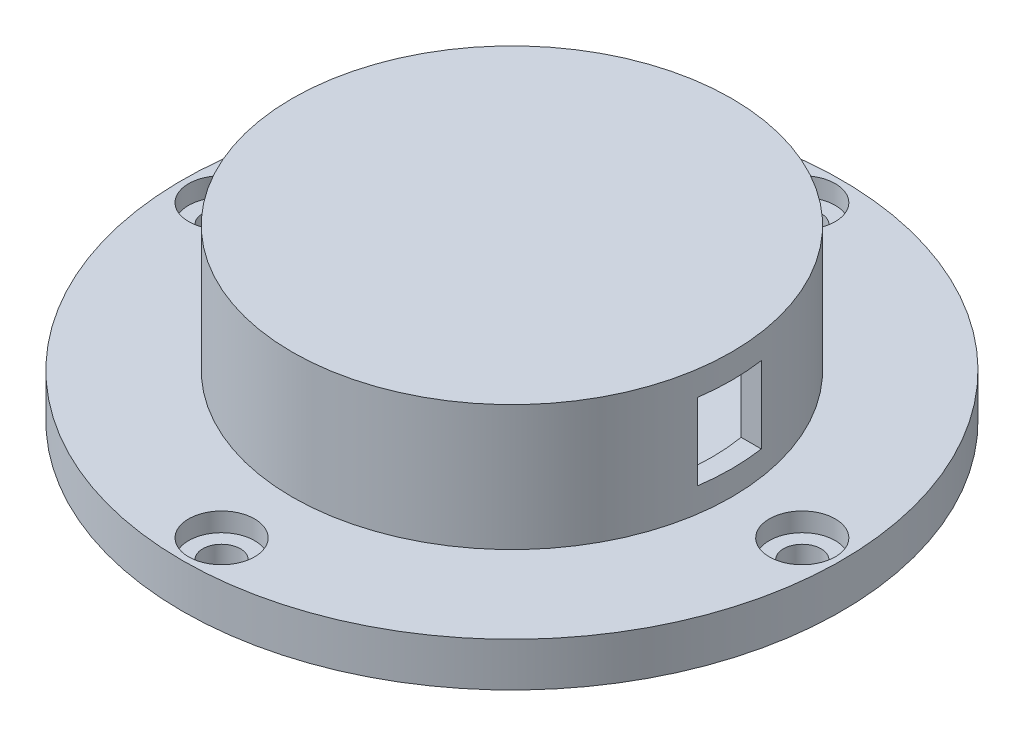
ISO-10303-21;
HEADER;
FILE_DESCRIPTION(('STEP AP214'),'2;1');
FILE_NAME('part.step','',(''),(''),'','','');
FILE_SCHEMA(('AUTOMOTIVE_DESIGN { 1 0 10303 214 1 1 1 1 }'));
ENDSEC;
DATA;
#1=APPLICATION_CONTEXT('core data for automotive mechanical design processes');
#2=APPLICATION_PROTOCOL_DEFINITION('international standard','automotive_design',2000,#1);
#3=PRODUCT_CONTEXT('',#1,'mechanical');
#4=PRODUCT('Part','Part','',(#3));
#5=PRODUCT_RELATED_PRODUCT_CATEGORY('part','',(#4));
#6=PRODUCT_DEFINITION_FORMATION('','',#4);
#7=PRODUCT_DEFINITION_CONTEXT('part definition',#1,'design');
#8=PRODUCT_DEFINITION('design','',#6,#7);
#9=PRODUCT_DEFINITION_SHAPE('','',#8);
#10=(LENGTH_UNIT() NAMED_UNIT(*) SI_UNIT(.MILLI.,.METRE.));
#11=(NAMED_UNIT(*) PLANE_ANGLE_UNIT() SI_UNIT($,.RADIAN.));
#12=(NAMED_UNIT(*) SI_UNIT($,.STERADIAN.) SOLID_ANGLE_UNIT());
#13=UNCERTAINTY_MEASURE_WITH_UNIT(LENGTH_MEASURE(1.E-05),#10,'distance_accuracy_value','');
#14=(GEOMETRIC_REPRESENTATION_CONTEXT(3) GLOBAL_UNCERTAINTY_ASSIGNED_CONTEXT((#13)) GLOBAL_UNIT_ASSIGNED_CONTEXT((#10,
#11,#12)) REPRESENTATION_CONTEXT('',''));
#15=CARTESIAN_POINT('',(0.,0.,0.));
#16=DIRECTION('',(0.,0.,1.));
#17=DIRECTION('',(1.,0.,0.));
#18=AXIS2_PLACEMENT_3D('',#15,#16,#17);
#19=CARTESIAN_POINT('',(0.,27.,0.));
#20=DIRECTION('',(0.,-1.,0.));
#21=DIRECTION('',(0.,0.,-1.));
#22=AXIS2_PLACEMENT_3D('',#19,#20,#21);
#23=CYLINDRICAL_SURFACE('',#22,31.83);
#24=DIRECTION('',(0.,-1.,0.));
#25=VECTOR('',#24,1.);
#26=CARTESIAN_POINT('',(-31.4187666848971,27.,5.1));
#27=LINE('',#26,#25);
#28=CARTESIAN_POINT('',(-31.4187666848971,23.1,5.1));
#29=VERTEX_POINT('',#28);
#30=CARTESIAN_POINT('',(-31.4187666848971,10.9,5.1));
#31=VERTEX_POINT('',#30);
#32=EDGE_CURVE('E239',#29,#31,#27,.T.);
#33=ORIENTED_EDGE('',*,*,#32,.F.);
#34=CARTESIAN_POINT('',(0.,23.1,0.));
#35=DIRECTION('',(0.,-1.,0.));
#36=DIRECTION('',(0.,0.,-1.));
#37=AXIS2_PLACEMENT_3D('',#34,#35,#36);
#38=CIRCLE('',#37,31.83);
#39=CARTESIAN_POINT('',(-31.4187666848971,23.1,-5.1));
#40=VERTEX_POINT('',#39);
#41=EDGE_CURVE('E11',#29,#40,#38,.T.);
#42=ORIENTED_EDGE('',*,*,#41,.T.);
#43=DIRECTION('',(0.,-1.,0.));
#44=VECTOR('',#43,1.);
#45=CARTESIAN_POINT('',(-31.4187666848971,27.,-5.1));
#46=LINE('',#45,#44);
#47=CARTESIAN_POINT('',(-31.4187666848971,10.9,-5.1));
#48=VERTEX_POINT('',#47);
#49=EDGE_CURVE('E47',#40,#48,#46,.T.);
#50=ORIENTED_EDGE('',*,*,#49,.T.);
#51=CARTESIAN_POINT('',(0.,10.9,0.));
#52=DIRECTION('',(0.,-1.,0.));
#53=DIRECTION('',(0.,0.,-1.));
#54=AXIS2_PLACEMENT_3D('',#51,#52,#53);
#55=CIRCLE('',#54,31.83);
#56=EDGE_CURVE('E234',#31,#48,#55,.T.);
#57=ORIENTED_EDGE('',*,*,#56,.F.);
#58=EDGE_LOOP('',(#33,#42,#50,#57));
#59=FACE_BOUND('',#58,.T.);
#60=DIRECTION('',(0.,-1.,0.));
#61=VECTOR('',#60,1.);
#62=CARTESIAN_POINT('',(31.4187666848971,27.,-5.1));
#63=LINE('',#62,#61);
#64=CARTESIAN_POINT('',(31.4187666848971,10.9,-5.1));
#65=VERTEX_POINT('',#64);
#66=CARTESIAN_POINT('',(31.4187666848971,23.1,-5.1));
#67=VERTEX_POINT('',#66);
#68=EDGE_CURVE('E233',#65,#67,#63,.F.);
#69=ORIENTED_EDGE('',*,*,#68,.T.);
#70=CARTESIAN_POINT('',(31.4187666848971,23.1,5.1));
#71=VERTEX_POINT('',#70);
#72=EDGE_CURVE('E54',#67,#71,#38,.T.);
#73=ORIENTED_EDGE('',*,*,#72,.T.);
#74=DIRECTION('',(0.,-1.,0.));
#75=VECTOR('',#74,1.);
#76=CARTESIAN_POINT('',(31.4187666848971,27.,5.1));
#77=LINE('',#76,#75);
#78=CARTESIAN_POINT('',(31.4187666848971,10.9,5.1));
#79=VERTEX_POINT('',#78);
#80=EDGE_CURVE('E196',#79,#71,#77,.F.);
#81=ORIENTED_EDGE('',*,*,#80,.F.);
#82=EDGE_CURVE('E229',#65,#79,#55,.T.);
#83=ORIENTED_EDGE('',*,*,#82,.F.);
#84=EDGE_LOOP('',(#69,#73,#81,#83));
#85=FACE_BOUND('',#84,.T.);
#86=CARTESIAN_POINT('',(0.,7.,0.));
#87=DIRECTION('',(0.,1.,0.));
#88=DIRECTION('',(0.,0.,1.));
#89=AXIS2_PLACEMENT_3D('',#86,#87,#88);
#90=CIRCLE('',#89,31.83);
#91=CARTESIAN_POINT('',(0.,7.,31.83));
#92=VERTEX_POINT('',#91);
#93=EDGE_CURVE('E189',#92,#92,#90,.F.);
#94=ORIENTED_EDGE('',*,*,#93,.T.);
#95=EDGE_LOOP('',(#94));
#96=FACE_BOUND('',#95,.T.);
#97=CARTESIAN_POINT('',(0.,24.,0.));
#98=DIRECTION('',(0.,1.,0.));
#99=DIRECTION('',(0.,0.,1.));
#100=AXIS2_PLACEMENT_3D('',#97,#98,#99);
#101=CIRCLE('',#100,31.83);
#102=CARTESIAN_POINT('',(0.,24.,31.83));
#103=VERTEX_POINT('',#102);
#104=EDGE_CURVE('E290',#103,#103,#101,.T.);
#105=ORIENTED_EDGE('',*,*,#104,.T.);
#106=EDGE_LOOP('',(#105));
#107=FACE_BOUND('',#106,.T.);
#108=ADVANCED_FACE('F43',(#59,#85,#96,#107),#23,.F.);
#109=CARTESIAN_POINT('',(0.,27.,0.));
#110=DIRECTION('',(0.,-1.,0.));
#111=DIRECTION('',(0.,0.,-1.));
#112=AXIS2_PLACEMENT_3D('',#109,#110,#111);
#113=CYLINDRICAL_SURFACE('',#112,35.);
#114=CARTESIAN_POINT('',(0.,23.1,0.));
#115=DIRECTION('',(0.,-1.,0.));
#116=DIRECTION('',(0.,0.,-1.));
#117=AXIS2_PLACEMENT_3D('',#114,#115,#116);
#118=CIRCLE('',#117,35.);
#119=CARTESIAN_POINT('',(34.6264349883149,23.1,-5.1));
#120=VERTEX_POINT('',#119);
#121=CARTESIAN_POINT('',(34.6264349883149,23.1,5.1));
#122=VERTEX_POINT('',#121);
#123=EDGE_CURVE('E134',#120,#122,#118,.T.);
#124=ORIENTED_EDGE('',*,*,#123,.F.);
#125=DIRECTION('',(0.,-1.,0.));
#126=VECTOR('',#125,1.);
#127=CARTESIAN_POINT('',(34.6264349883149,27.,-5.1));
#128=LINE('',#127,#126);
#129=CARTESIAN_POINT('',(34.6264349883149,10.9,-5.1));
#130=VERTEX_POINT('',#129);
#131=EDGE_CURVE('E139',#130,#120,#128,.F.);
#132=ORIENTED_EDGE('',*,*,#131,.F.);
#133=CARTESIAN_POINT('',(0.,10.9,0.));
#134=DIRECTION('',(0.,-1.,0.));
#135=DIRECTION('',(0.,0.,-1.));
#136=AXIS2_PLACEMENT_3D('',#133,#134,#135);
#137=CIRCLE('',#136,35.);
#138=CARTESIAN_POINT('',(34.6264349883149,10.9,5.1));
#139=VERTEX_POINT('',#138);
#140=EDGE_CURVE('E267',#130,#139,#137,.T.);
#141=ORIENTED_EDGE('',*,*,#140,.T.);
#142=DIRECTION('',(0.,-1.,0.));
#143=VECTOR('',#142,1.);
#144=CARTESIAN_POINT('',(34.6264349883149,27.,5.1));
#145=LINE('',#144,#143);
#146=EDGE_CURVE('E119',#139,#122,#145,.F.);
#147=ORIENTED_EDGE('',*,*,#146,.T.);
#148=EDGE_LOOP('',(#124,#132,#141,#147));
#149=FACE_BOUND('',#148,.T.);
#150=CARTESIAN_POINT('',(0.,27.,0.));
#151=DIRECTION('',(0.,1.,0.));
#152=DIRECTION('',(0.,0.,1.));
#153=AXIS2_PLACEMENT_3D('',#150,#151,#152);
#154=CIRCLE('',#153,35.);
#155=CARTESIAN_POINT('',(0.,27.,35.));
#156=VERTEX_POINT('',#155);
#157=EDGE_CURVE('E175',#156,#156,#154,.T.);
#158=ORIENTED_EDGE('',*,*,#157,.F.);
#159=EDGE_LOOP('',(#158));
#160=FACE_BOUND('',#159,.T.);
#161=CARTESIAN_POINT('',(0.,7.,0.));
#162=DIRECTION('',(0.,1.,0.));
#163=DIRECTION('',(0.,0.,1.));
#164=AXIS2_PLACEMENT_3D('',#161,#162,#163);
#165=CIRCLE('',#164,35.);
#166=CARTESIAN_POINT('',(0.,7.,35.));
#167=VERTEX_POINT('',#166);
#168=EDGE_CURVE('E180',#167,#167,#165,.T.);
#169=ORIENTED_EDGE('',*,*,#168,.T.);
#170=EDGE_LOOP('',(#169));
#171=FACE_BOUND('',#170,.T.);
#172=CARTESIAN_POINT('',(-34.6264349883149,23.1,5.1));
#173=VERTEX_POINT('',#172);
#174=CARTESIAN_POINT('',(-34.6264349883149,23.1,-5.1));
#175=VERTEX_POINT('',#174);
#176=EDGE_CURVE('E124',#173,#175,#118,.T.);
#177=ORIENTED_EDGE('',*,*,#176,.F.);
#178=DIRECTION('',(0.,-1.,0.));
#179=VECTOR('',#178,1.);
#180=CARTESIAN_POINT('',(-34.6264349883149,27.,5.1));
#181=LINE('',#180,#179);
#182=CARTESIAN_POINT('',(-34.6264349883149,10.9,5.1));
#183=VERTEX_POINT('',#182);
#184=EDGE_CURVE('E109',#173,#183,#181,.T.);
#185=ORIENTED_EDGE('',*,*,#184,.T.);
#186=CARTESIAN_POINT('',(-34.6264349883149,10.9,-5.1));
#187=VERTEX_POINT('',#186);
#188=EDGE_CURVE('E118',#183,#187,#137,.T.);
#189=ORIENTED_EDGE('',*,*,#188,.T.);
#190=DIRECTION('',(0.,-1.,0.));
#191=VECTOR('',#190,1.);
#192=CARTESIAN_POINT('',(-34.6264349883149,27.,-5.1));
#193=LINE('',#192,#191);
#194=EDGE_CURVE('E132',#175,#187,#193,.T.);
#195=ORIENTED_EDGE('',*,*,#194,.F.);
#196=EDGE_LOOP('',(#177,#185,#189,#195));
#197=FACE_BOUND('',#196,.T.);
#198=ADVANCED_FACE('F131',(#149,#160,#171,#197),#113,.T.);
#199=CARTESIAN_POINT('',(46.2500000000013,-13.,-1.3060080739871E-12));
#200=DIRECTION('',(0.,1.,0.));
#201=DIRECTION('',(0.,0.,1.));
#202=AXIS2_PLACEMENT_3D('',#199,#200,#201);
#203=CYLINDRICAL_SURFACE('',#202,3.00000000000103);
#204=CARTESIAN_POINT('',(46.2500000000013,0.,-1.3060080739871E-12));
#205=DIRECTION('',(0.,1.,0.));
#206=DIRECTION('',(0.,0.,1.));
#207=AXIS2_PLACEMENT_3D('',#204,#205,#206);
#208=CIRCLE('',#207,3.00000000000103);
#209=CARTESIAN_POINT('',(46.2500000000013,0.,2.99999999999972));
#210=VERTEX_POINT('',#209);
#211=EDGE_CURVE('E197',#210,#210,#208,.T.);
#212=ORIENTED_EDGE('',*,*,#211,.F.);
#213=EDGE_LOOP('',(#212));
#214=FACE_BOUND('',#213,.T.);
#215=CARTESIAN_POINT('',(46.2500000000013,4.,-1.3060080739871E-12));
#216=DIRECTION('',(0.,1.,0.));
#217=DIRECTION('',(0.,0.,1.));
#218=AXIS2_PLACEMENT_3D('',#215,#216,#217);
#219=CIRCLE('',#218,3.00000000000103);
#220=CARTESIAN_POINT('',(46.2500000000013,4.,2.99999999999972));
#221=VERTEX_POINT('',#220);
#222=EDGE_CURVE('E202',#221,#221,#219,.F.);
#223=ORIENTED_EDGE('',*,*,#222,.F.);
#224=EDGE_LOOP('',(#223));
#225=FACE_BOUND('',#224,.T.);
#226=ADVANCED_FACE('F312',(#214,#225),#203,.F.);
#227=CARTESIAN_POINT('',(2.61278155222367E-12,-13.,46.25));
#228=DIRECTION('',(0.,1.,0.));
#229=DIRECTION('',(0.,0.,1.));
#230=AXIS2_PLACEMENT_3D('',#227,#228,#229);
#231=CYLINDRICAL_SURFACE('',#230,3.00000000000281);
#232=CARTESIAN_POINT('',(2.61278155222367E-12,0.,46.25));
#233=DIRECTION('',(0.,1.,0.));
#234=DIRECTION('',(0.,0.,1.));
#235=AXIS2_PLACEMENT_3D('',#232,#233,#234);
#236=CIRCLE('',#235,3.00000000000281);
#237=CARTESIAN_POINT('',(2.61278155222367E-12,0.,49.2500000000028));
#238=VERTEX_POINT('',#237);
#239=EDGE_CURVE('E201',#238,#238,#236,.T.);
#240=ORIENTED_EDGE('',*,*,#239,.F.);
#241=EDGE_LOOP('',(#240));
#242=FACE_BOUND('',#241,.T.);
#243=CARTESIAN_POINT('',(2.61278155222367E-12,4.,46.25));
#244=DIRECTION('',(0.,1.,0.));
#245=DIRECTION('',(0.,0.,1.));
#246=AXIS2_PLACEMENT_3D('',#243,#244,#245);
#247=CIRCLE('',#246,3.00000000000281);
#248=CARTESIAN_POINT('',(2.61278155222367E-12,4.,49.2500000000028));
#249=VERTEX_POINT('',#248);
#250=EDGE_CURVE('E220',#249,#249,#247,.F.);
#251=ORIENTED_EDGE('',*,*,#250,.F.);
#252=EDGE_LOOP('',(#251));
#253=FACE_BOUND('',#252,.T.);
#254=ADVANCED_FACE('F355',(#242,#253),#231,.F.);
#255=CARTESIAN_POINT('',(-46.2499999999987,-13.,1.31167206543316E-12));
#256=DIRECTION('',(0.,1.,0.));
#257=DIRECTION('',(0.,0.,1.));
#258=AXIS2_PLACEMENT_3D('',#255,#256,#257);
#259=CYLINDRICAL_SURFACE('',#258,3.0000000000021);
#260=CARTESIAN_POINT('',(-46.2499999999987,0.,1.31167206543316E-12));
#261=DIRECTION('',(0.,1.,0.));
#262=DIRECTION('',(0.,0.,1.));
#263=AXIS2_PLACEMENT_3D('',#260,#261,#262);
#264=CIRCLE('',#263,3.0000000000021);
#265=CARTESIAN_POINT('',(-46.2499999999987,0.,3.00000000000341));
#266=VERTEX_POINT('',#265);
#267=EDGE_CURVE('E206',#266,#266,#264,.T.);
#268=ORIENTED_EDGE('',*,*,#267,.F.);
#269=EDGE_LOOP('',(#268));
#270=FACE_BOUND('',#269,.T.);
#271=CARTESIAN_POINT('',(-46.2499999999987,4.,1.31167206543316E-12));
#272=DIRECTION('',(0.,1.,0.));
#273=DIRECTION('',(0.,0.,1.));
#274=AXIS2_PLACEMENT_3D('',#271,#272,#273);
#275=CIRCLE('',#274,3.0000000000021);
#276=CARTESIAN_POINT('',(-46.2499999999987,4.,3.00000000000341));
#277=VERTEX_POINT('',#276);
#278=EDGE_CURVE('E216',#277,#277,#275,.F.);
#279=ORIENTED_EDGE('',*,*,#278,.F.);
#280=EDGE_LOOP('',(#279));
#281=FACE_BOUND('',#280,.T.);
#282=ADVANCED_FACE('F347',(#270,#281),#259,.F.);
#283=CARTESIAN_POINT('',(0.,-13.,-46.25));
#284=DIRECTION('',(0.,1.,0.));
#285=DIRECTION('',(0.,0.,1.));
#286=AXIS2_PLACEMENT_3D('',#283,#284,#285);
#287=CYLINDRICAL_SURFACE('',#286,3.);
#288=CARTESIAN_POINT('',(0.,0.,-46.25));
#289=DIRECTION('',(0.,1.,0.));
#290=DIRECTION('',(0.,0.,1.));
#291=AXIS2_PLACEMENT_3D('',#288,#289,#290);
#292=CIRCLE('',#291,3.);
#293=CARTESIAN_POINT('',(0.,0.,-43.25));
#294=VERTEX_POINT('',#293);
#295=EDGE_CURVE('E184',#294,#294,#292,.T.);
#296=ORIENTED_EDGE('',*,*,#295,.F.);
#297=EDGE_LOOP('',(#296));
#298=FACE_BOUND('',#297,.T.);
#299=CARTESIAN_POINT('',(0.,4.,-46.25));
#300=DIRECTION('',(0.,1.,0.));
#301=DIRECTION('',(0.,0.,1.));
#302=AXIS2_PLACEMENT_3D('',#299,#300,#301);
#303=CIRCLE('',#302,3.);
#304=CARTESIAN_POINT('',(0.,4.,-43.25));
#305=VERTEX_POINT('',#304);
#306=EDGE_CURVE('E147',#305,#305,#303,.F.);
#307=ORIENTED_EDGE('',*,*,#306,.F.);
#308=EDGE_LOOP('',(#307));
#309=FACE_BOUND('',#308,.T.);
#310=ADVANCED_FACE('F342',(#298,#309),#287,.F.);
#311=CARTESIAN_POINT('',(0.,7.,0.));
#312=DIRECTION('',(0.,-1.,0.));
#313=DIRECTION('',(0.,0.,-1.));
#314=AXIS2_PLACEMENT_3D('',#311,#312,#313);
#315=CYLINDRICAL_SURFACE('',#314,52.5);
#316=CARTESIAN_POINT('',(0.,7.,0.));
#317=DIRECTION('',(0.,1.,0.));
#318=DIRECTION('',(0.,0.,1.));
#319=AXIS2_PLACEMENT_3D('',#316,#317,#318);
#320=CIRCLE('',#319,52.5);
#321=CARTESIAN_POINT('',(0.,7.,52.5));
#322=VERTEX_POINT('',#321);
#323=EDGE_CURVE('E185',#322,#322,#320,.T.);
#324=ORIENTED_EDGE('',*,*,#323,.F.);
#325=EDGE_LOOP('',(#324));
#326=FACE_BOUND('',#325,.T.);
#327=CARTESIAN_POINT('',(0.,0.,0.));
#328=DIRECTION('',(0.,1.,0.));
#329=DIRECTION('',(0.,0.,1.));
#330=AXIS2_PLACEMENT_3D('',#327,#328,#329);
#331=CIRCLE('',#330,52.5);
#332=CARTESIAN_POINT('',(0.,0.,52.5));
#333=VERTEX_POINT('',#332);
#334=EDGE_CURVE('E179',#333,#333,#331,.T.);
#335=ORIENTED_EDGE('',*,*,#334,.T.);
#336=EDGE_LOOP('',(#335));
#337=FACE_BOUND('',#336,.T.);
#338=ADVANCED_FACE('F45',(#326,#337),#315,.T.);
#339=CARTESIAN_POINT('',(0.,7.,0.));
#340=DIRECTION('',(0.,1.,0.));
#341=DIRECTION('',(0.,0.,1.));
#342=AXIS2_PLACEMENT_3D('',#339,#340,#341);
#343=PLANE('',#342);
#344=CARTESIAN_POINT('',(0.,7.,-46.25));
#345=DIRECTION('',(0.,1.,0.));
#346=DIRECTION('',(0.,0.,1.));
#347=AXIS2_PLACEMENT_3D('',#344,#345,#346);
#348=CIRCLE('',#347,5.25);
#349=CARTESIAN_POINT('',(0.,7.,-41.));
#350=VERTEX_POINT('',#349);
#351=EDGE_CURVE('E148',#350,#350,#348,.T.);
#352=ORIENTED_EDGE('',*,*,#351,.F.);
#353=EDGE_LOOP('',(#352));
#354=FACE_BOUND('',#353,.T.);
#355=CARTESIAN_POINT('',(46.2500000000013,7.,-1.3060080739871E-12));
#356=DIRECTION('',(0.,1.,0.));
#357=DIRECTION('',(0.,0.,1.));
#358=AXIS2_PLACEMENT_3D('',#355,#356,#357);
#359=CIRCLE('',#358,5.25000000000102);
#360=CARTESIAN_POINT('',(46.2500000000013,7.,5.24999999999972));
#361=VERTEX_POINT('',#360);
#362=EDGE_CURVE('E156',#361,#361,#359,.T.);
#363=ORIENTED_EDGE('',*,*,#362,.F.);
#364=EDGE_LOOP('',(#363));
#365=FACE_BOUND('',#364,.T.);
#366=CARTESIAN_POINT('',(2.61278155222367E-12,7.,46.25));
#367=DIRECTION('',(0.,1.,0.));
#368=DIRECTION('',(0.,0.,1.));
#369=AXIS2_PLACEMENT_3D('',#366,#367,#368);
#370=CIRCLE('',#369,5.25000000000281);
#371=CARTESIAN_POINT('',(2.61278155222367E-12,7.,51.5000000000028));
#372=VERTEX_POINT('',#371);
#373=EDGE_CURVE('E164',#372,#372,#370,.T.);
#374=ORIENTED_EDGE('',*,*,#373,.F.);
#375=EDGE_LOOP('',(#374));
#376=FACE_BOUND('',#375,.T.);
#377=CARTESIAN_POINT('',(-46.2499999999987,7.,1.31167206543316E-12));
#378=DIRECTION('',(0.,1.,0.));
#379=DIRECTION('',(0.,0.,1.));
#380=AXIS2_PLACEMENT_3D('',#377,#378,#379);
#381=CIRCLE('',#380,5.2500000000021);
#382=CARTESIAN_POINT('',(-46.2499999999987,7.,5.25000000000341));
#383=VERTEX_POINT('',#382);
#384=EDGE_CURVE('E138',#383,#383,#381,.T.);
#385=ORIENTED_EDGE('',*,*,#384,.F.);
#386=EDGE_LOOP('',(#385));
#387=FACE_BOUND('',#386,.T.);
#388=ORIENTED_EDGE('',*,*,#168,.F.);
#389=EDGE_LOOP('',(#388));
#390=FACE_BOUND('',#389,.T.);
#391=ORIENTED_EDGE('',*,*,#323,.T.);
#392=EDGE_LOOP('',(#391));
#393=FACE_BOUND('',#392,.T.);
#394=ADVANCED_FACE('F323',(#354,#365,#376,#387,#390,#393),#343,.T.);
#395=CARTESIAN_POINT('',(0.,0.,0.));
#396=DIRECTION('',(0.,1.,0.));
#397=DIRECTION('',(0.,0.,1.));
#398=AXIS2_PLACEMENT_3D('',#395,#396,#397);
#399=PLANE('',#398);
#400=ORIENTED_EDGE('',*,*,#295,.T.);
#401=EDGE_LOOP('',(#400));
#402=FACE_BOUND('',#401,.T.);
#403=ORIENTED_EDGE('',*,*,#267,.T.);
#404=EDGE_LOOP('',(#403));
#405=FACE_BOUND('',#404,.T.);
#406=ORIENTED_EDGE('',*,*,#239,.T.);
#407=EDGE_LOOP('',(#406));
#408=FACE_BOUND('',#407,.T.);
#409=ORIENTED_EDGE('',*,*,#211,.T.);
#410=EDGE_LOOP('',(#409));
#411=FACE_BOUND('',#410,.T.);
#412=ORIENTED_EDGE('',*,*,#334,.F.);
#413=EDGE_LOOP('',(#412));
#414=FACE_BOUND('',#413,.T.);
#415=ADVANCED_FACE('F320',(#402,#405,#408,#411,#414),#399,.F.);
#416=CARTESIAN_POINT('',(0.,27.,0.));
#417=DIRECTION('',(0.,1.,0.));
#418=DIRECTION('',(0.,0.,1.));
#419=AXIS2_PLACEMENT_3D('',#416,#417,#418);
#420=PLANE('',#419);
#421=ORIENTED_EDGE('',*,*,#157,.T.);
#422=EDGE_LOOP('',(#421));
#423=FACE_BOUND('',#422,.T.);
#424=ADVANCED_FACE('F317',(#423),#420,.T.);
#425=ORIENTED_EDGE('',*,*,#93,.F.);
#426=EDGE_LOOP('',(#425));
#427=FACE_BOUND('',#426,.T.);
#428=ADVANCED_FACE('F319',(#427),#343,.T.);
#429=CARTESIAN_POINT('',(0.,4.,-46.25));
#430=DIRECTION('',(0.,1.,0.));
#431=DIRECTION('',(0.,0.,1.));
#432=AXIS2_PLACEMENT_3D('',#429,#430,#431);
#433=PLANE('',#432);
#434=CARTESIAN_POINT('',(0.,4.,-46.25));
#435=DIRECTION('',(0.,1.,0.));
#436=DIRECTION('',(0.,0.,1.));
#437=AXIS2_PLACEMENT_3D('',#434,#435,#436);
#438=CIRCLE('',#437,5.25);
#439=CARTESIAN_POINT('',(0.,4.,-41.));
#440=VERTEX_POINT('',#439);
#441=EDGE_CURVE('E143',#440,#440,#438,.T.);
#442=ORIENTED_EDGE('',*,*,#441,.T.);
#443=EDGE_LOOP('',(#442));
#444=FACE_BOUND('',#443,.T.);
#445=ORIENTED_EDGE('',*,*,#306,.T.);
#446=EDGE_LOOP('',(#445));
#447=FACE_BOUND('',#446,.T.);
#448=ADVANCED_FACE('F394',(#444,#447),#433,.T.);
#449=CARTESIAN_POINT('',(0.,4.,-46.25));
#450=DIRECTION('',(0.,1.,0.));
#451=DIRECTION('',(0.,0.,1.));
#452=AXIS2_PLACEMENT_3D('',#449,#450,#451);
#453=CYLINDRICAL_SURFACE('',#452,5.25);
#454=ORIENTED_EDGE('',*,*,#441,.F.);
#455=EDGE_LOOP('',(#454));
#456=FACE_BOUND('',#455,.T.);
#457=ORIENTED_EDGE('',*,*,#351,.T.);
#458=EDGE_LOOP('',(#457));
#459=FACE_BOUND('',#458,.T.);
#460=ADVANCED_FACE('F389',(#456,#459),#453,.F.);
#461=CARTESIAN_POINT('',(-46.2499999999987,4.,1.31167206543316E-12));
#462=DIRECTION('',(0.,1.,0.));
#463=DIRECTION('',(0.,0.,1.));
#464=AXIS2_PLACEMENT_3D('',#461,#462,#463);
#465=PLANE('',#464);
#466=CARTESIAN_POINT('',(-46.2499999999987,4.,1.31167206543316E-12));
#467=DIRECTION('',(0.,1.,0.));
#468=DIRECTION('',(0.,0.,1.));
#469=AXIS2_PLACEMENT_3D('',#466,#467,#468);
#470=CIRCLE('',#469,5.2500000000021);
#471=CARTESIAN_POINT('',(-46.2499999999987,4.,5.25000000000341));
#472=VERTEX_POINT('',#471);
#473=EDGE_CURVE('E168',#472,#472,#470,.T.);
#474=ORIENTED_EDGE('',*,*,#473,.T.);
#475=EDGE_LOOP('',(#474));
#476=FACE_BOUND('',#475,.T.);
#477=ORIENTED_EDGE('',*,*,#278,.T.);
#478=EDGE_LOOP('',(#477));
#479=FACE_BOUND('',#478,.T.);
#480=ADVANCED_FACE('F383',(#476,#479),#465,.T.);
#481=CARTESIAN_POINT('',(-46.2499999999987,4.,1.31167206543316E-12));
#482=DIRECTION('',(0.,1.,0.));
#483=DIRECTION('',(0.,0.,1.));
#484=AXIS2_PLACEMENT_3D('',#481,#482,#483);
#485=CYLINDRICAL_SURFACE('',#484,5.2500000000021);
#486=ORIENTED_EDGE('',*,*,#473,.F.);
#487=EDGE_LOOP('',(#486));
#488=FACE_BOUND('',#487,.T.);
#489=ORIENTED_EDGE('',*,*,#384,.T.);
#490=EDGE_LOOP('',(#489));
#491=FACE_BOUND('',#490,.T.);
#492=ADVANCED_FACE('F360',(#488,#491),#485,.F.);
#493=CARTESIAN_POINT('',(2.61278155222367E-12,4.,46.25));
#494=DIRECTION('',(0.,1.,0.));
#495=DIRECTION('',(0.,0.,1.));
#496=AXIS2_PLACEMENT_3D('',#493,#494,#495);
#497=PLANE('',#496);
#498=CARTESIAN_POINT('',(2.61278155222367E-12,4.,46.25));
#499=DIRECTION('',(0.,1.,0.));
#500=DIRECTION('',(0.,0.,1.));
#501=AXIS2_PLACEMENT_3D('',#498,#499,#500);
#502=CIRCLE('',#501,5.25000000000281);
#503=CARTESIAN_POINT('',(2.61278155222367E-12,4.,51.5000000000028));
#504=VERTEX_POINT('',#503);
#505=EDGE_CURVE('E160',#504,#504,#502,.T.);
#506=ORIENTED_EDGE('',*,*,#505,.T.);
#507=EDGE_LOOP('',(#506));
#508=FACE_BOUND('',#507,.T.);
#509=ORIENTED_EDGE('',*,*,#250,.T.);
#510=EDGE_LOOP('',(#509));
#511=FACE_BOUND('',#510,.T.);
#512=ADVANCED_FACE('F371',(#508,#511),#497,.T.);
#513=CARTESIAN_POINT('',(2.61278155222367E-12,4.,46.25));
#514=DIRECTION('',(0.,1.,0.));
#515=DIRECTION('',(0.,0.,1.));
#516=AXIS2_PLACEMENT_3D('',#513,#514,#515);
#517=CYLINDRICAL_SURFACE('',#516,5.25000000000281);
#518=ORIENTED_EDGE('',*,*,#505,.F.);
#519=EDGE_LOOP('',(#518));
#520=FACE_BOUND('',#519,.T.);
#521=ORIENTED_EDGE('',*,*,#373,.T.);
#522=EDGE_LOOP('',(#521));
#523=FACE_BOUND('',#522,.T.);
#524=ADVANCED_FACE('F373',(#520,#523),#517,.F.);
#525=CARTESIAN_POINT('',(46.2500000000013,4.,-1.3060080739871E-12));
#526=DIRECTION('',(0.,1.,0.));
#527=DIRECTION('',(0.,0.,1.));
#528=AXIS2_PLACEMENT_3D('',#525,#526,#527);
#529=PLANE('',#528);
#530=CARTESIAN_POINT('',(46.2500000000013,4.,-1.3060080739871E-12));
#531=DIRECTION('',(0.,1.,0.));
#532=DIRECTION('',(0.,0.,1.));
#533=AXIS2_PLACEMENT_3D('',#530,#531,#532);
#534=CIRCLE('',#533,5.25000000000102);
#535=CARTESIAN_POINT('',(46.2500000000013,4.,5.24999999999972));
#536=VERTEX_POINT('',#535);
#537=EDGE_CURVE('E152',#536,#536,#534,.T.);
#538=ORIENTED_EDGE('',*,*,#537,.T.);
#539=EDGE_LOOP('',(#538));
#540=FACE_BOUND('',#539,.T.);
#541=ORIENTED_EDGE('',*,*,#222,.T.);
#542=EDGE_LOOP('',(#541));
#543=FACE_BOUND('',#542,.T.);
#544=ADVANCED_FACE('F380',(#540,#543),#529,.T.);
#545=CARTESIAN_POINT('',(46.2500000000013,4.,-1.3060080739871E-12));
#546=DIRECTION('',(0.,1.,0.));
#547=DIRECTION('',(0.,0.,1.));
#548=AXIS2_PLACEMENT_3D('',#545,#546,#547);
#549=CYLINDRICAL_SURFACE('',#548,5.25000000000102);
#550=ORIENTED_EDGE('',*,*,#537,.F.);
#551=EDGE_LOOP('',(#550));
#552=FACE_BOUND('',#551,.T.);
#553=ORIENTED_EDGE('',*,*,#362,.T.);
#554=EDGE_LOOP('',(#553));
#555=FACE_BOUND('',#554,.T.);
#556=ADVANCED_FACE('F386',(#552,#555),#549,.F.);
#557=CARTESIAN_POINT('',(-60.,23.1,5.1));
#558=DIRECTION('',(0.,0.,1.));
#559=DIRECTION('',(0.,-1.,0.));
#560=AXIS2_PLACEMENT_3D('',#557,#558,#559);
#561=PLANE('',#560);
#562=DIRECTION('',(1.,0.,0.));
#563=VECTOR('',#562,1.);
#564=CARTESIAN_POINT('',(-60.,10.9,5.1));
#565=LINE('',#564,#563);
#566=EDGE_CURVE('E128',#79,#139,#565,.T.);
#567=ORIENTED_EDGE('',*,*,#566,.F.);
#568=ORIENTED_EDGE('',*,*,#80,.T.);
#569=DIRECTION('',(1.,0.,0.));
#570=VECTOR('',#569,1.);
#571=CARTESIAN_POINT('',(-60.,23.1,5.1));
#572=LINE('',#571,#570);
#573=EDGE_CURVE('E69',#71,#122,#572,.T.);
#574=ORIENTED_EDGE('',*,*,#573,.T.);
#575=ORIENTED_EDGE('',*,*,#146,.F.);
#576=EDGE_LOOP('',(#567,#568,#574,#575));
#577=FACE_BOUND('',#576,.T.);
#578=ADVANCED_FACE('F304',(#577),#561,.F.);
#579=CARTESIAN_POINT('',(-60.,10.9,5.1));
#580=DIRECTION('',(0.,-1.,0.));
#581=DIRECTION('',(0.,0.,-1.));
#582=AXIS2_PLACEMENT_3D('',#579,#580,#581);
#583=PLANE('',#582);
#584=DIRECTION('',(1.,0.,0.));
#585=VECTOR('',#584,1.);
#586=CARTESIAN_POINT('',(-60.,10.9,-5.1));
#587=LINE('',#586,#585);
#588=EDGE_CURVE('E263',#65,#130,#587,.T.);
#589=ORIENTED_EDGE('',*,*,#588,.F.);
#590=ORIENTED_EDGE('',*,*,#82,.T.);
#591=ORIENTED_EDGE('',*,*,#566,.T.);
#592=ORIENTED_EDGE('',*,*,#140,.F.);
#593=EDGE_LOOP('',(#589,#590,#591,#592));
#594=FACE_BOUND('',#593,.T.);
#595=ADVANCED_FACE('F281',(#594),#583,.F.);
#596=CARTESIAN_POINT('',(-60.,23.1,-5.1));
#597=DIRECTION('',(0.,0.,1.));
#598=DIRECTION('',(0.,-1.,0.));
#599=AXIS2_PLACEMENT_3D('',#596,#597,#598);
#600=PLANE('',#599);
#601=ORIENTED_EDGE('',*,*,#131,.T.);
#602=DIRECTION('',(1.,0.,0.));
#603=VECTOR('',#602,1.);
#604=CARTESIAN_POINT('',(-60.,23.1,-5.1));
#605=LINE('',#604,#603);
#606=EDGE_CURVE('E255',#67,#120,#605,.T.);
#607=ORIENTED_EDGE('',*,*,#606,.F.);
#608=ORIENTED_EDGE('',*,*,#68,.F.);
#609=ORIENTED_EDGE('',*,*,#588,.T.);
#610=EDGE_LOOP('',(#601,#607,#608,#609));
#611=FACE_BOUND('',#610,.T.);
#612=ADVANCED_FACE('F283',(#611),#600,.T.);
#613=CARTESIAN_POINT('',(-60.,23.1,5.1));
#614=DIRECTION('',(0.,-1.,0.));
#615=DIRECTION('',(0.,0.,-1.));
#616=AXIS2_PLACEMENT_3D('',#613,#614,#615);
#617=PLANE('',#616);
#618=ORIENTED_EDGE('',*,*,#123,.T.);
#619=ORIENTED_EDGE('',*,*,#573,.F.);
#620=ORIENTED_EDGE('',*,*,#72,.F.);
#621=ORIENTED_EDGE('',*,*,#606,.T.);
#622=EDGE_LOOP('',(#618,#619,#620,#621));
#623=FACE_BOUND('',#622,.T.);
#624=ADVANCED_FACE('F441',(#623),#617,.T.);
#625=ORIENTED_EDGE('',*,*,#176,.T.);
#626=EDGE_CURVE('E252',#175,#40,#605,.T.);
#627=ORIENTED_EDGE('',*,*,#626,.T.);
#628=ORIENTED_EDGE('',*,*,#41,.F.);
#629=EDGE_CURVE('E112',#173,#29,#572,.T.);
#630=ORIENTED_EDGE('',*,*,#629,.F.);
#631=EDGE_LOOP('',(#625,#627,#628,#630));
#632=FACE_BOUND('',#631,.T.);
#633=ADVANCED_FACE('F122',(#632),#617,.T.);
#634=ORIENTED_EDGE('',*,*,#194,.T.);
#635=EDGE_CURVE('E253',#187,#48,#587,.T.);
#636=ORIENTED_EDGE('',*,*,#635,.T.);
#637=ORIENTED_EDGE('',*,*,#49,.F.);
#638=ORIENTED_EDGE('',*,*,#626,.F.);
#639=EDGE_LOOP('',(#634,#636,#637,#638));
#640=FACE_BOUND('',#639,.T.);
#641=ADVANCED_FACE('F251',(#640),#600,.T.);
#642=EDGE_CURVE('E61',#183,#31,#565,.T.);
#643=ORIENTED_EDGE('',*,*,#642,.T.);
#644=ORIENTED_EDGE('',*,*,#56,.T.);
#645=ORIENTED_EDGE('',*,*,#635,.F.);
#646=ORIENTED_EDGE('',*,*,#188,.F.);
#647=EDGE_LOOP('',(#643,#644,#645,#646));
#648=FACE_BOUND('',#647,.T.);
#649=ADVANCED_FACE('F302',(#648),#583,.F.);
#650=ORIENTED_EDGE('',*,*,#629,.T.);
#651=ORIENTED_EDGE('',*,*,#32,.T.);
#652=ORIENTED_EDGE('',*,*,#642,.F.);
#653=ORIENTED_EDGE('',*,*,#184,.F.);
#654=EDGE_LOOP('',(#650,#651,#652,#653));
#655=FACE_BOUND('',#654,.T.);
#656=ADVANCED_FACE('F111',(#655),#561,.F.);
#657=CARTESIAN_POINT('',(0.,24.,0.));
#658=DIRECTION('',(0.,1.,0.));
#659=DIRECTION('',(0.,0.,1.));
#660=AXIS2_PLACEMENT_3D('',#657,#658,#659);
#661=PLANE('',#660);
#662=ORIENTED_EDGE('',*,*,#104,.F.);
#663=EDGE_LOOP('',(#662));
#664=FACE_BOUND('',#663,.T.);
#665=ADVANCED_FACE('F296',(#664),#661,.F.);
#666=CLOSED_SHELL('',(#108,#198,#226,#254,#282,#310,#338,#394,#415,#424,#428,#448,#460,#480,
#492,#512,#524,#544,#556,#578,#595,#612,#624,#633,#641,#649,#656,#665));
#667=MANIFOLD_SOLID_BREP('B2',#666);
#668=ADVANCED_BREP_SHAPE_REPRESENTATION('',(#18,#667),#14);
#669=SHAPE_DEFINITION_REPRESENTATION(#9,#668);
ENDSEC;
END-ISO-10303-21;
